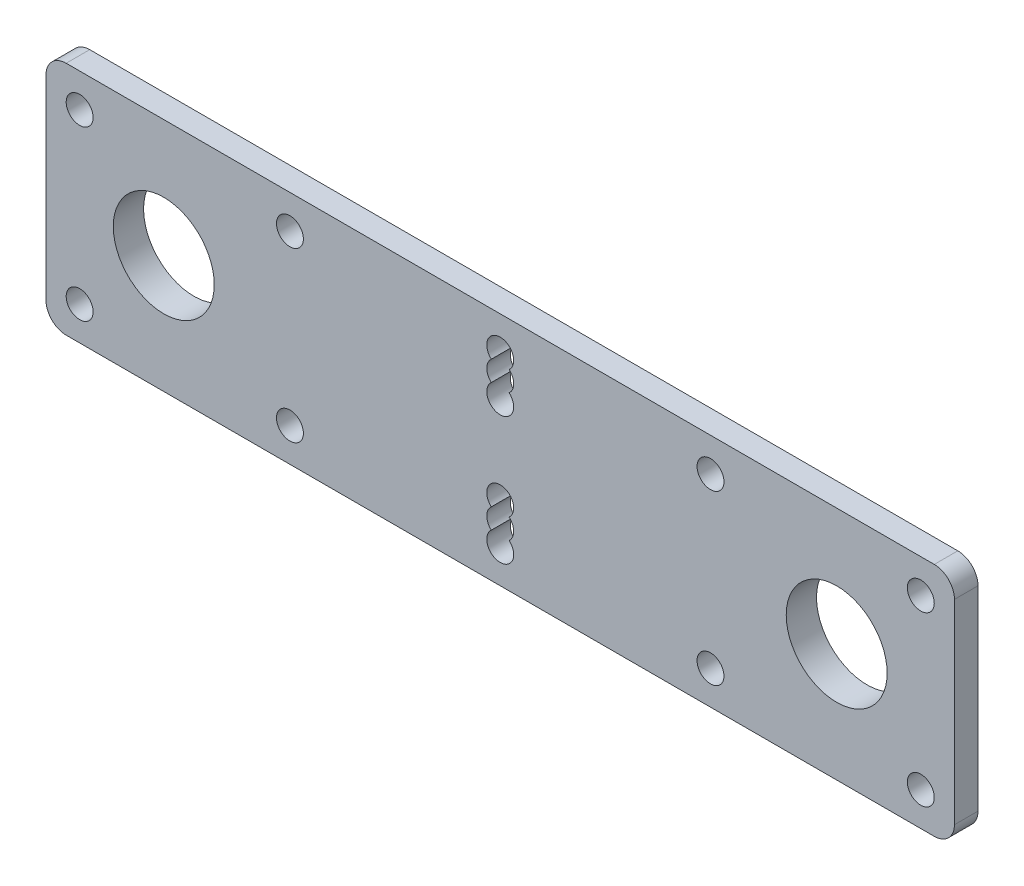
ISO-10303-21;
HEADER;
FILE_DESCRIPTION(('STEP AP214'),'2;1');
FILE_NAME('part.step','',(''),(''),'','','');
FILE_SCHEMA(('AUTOMOTIVE_DESIGN { 1 0 10303 214 1 1 1 1 }'));
ENDSEC;
DATA;
#1=APPLICATION_CONTEXT('core data for automotive mechanical design processes');
#2=APPLICATION_PROTOCOL_DEFINITION('international standard','automotive_design',2000,#1);
#3=PRODUCT_CONTEXT('',#1,'mechanical');
#4=PRODUCT('Part','Part','',(#3));
#5=PRODUCT_RELATED_PRODUCT_CATEGORY('part','',(#4));
#6=PRODUCT_DEFINITION_FORMATION('','',#4);
#7=PRODUCT_DEFINITION_CONTEXT('part definition',#1,'design');
#8=PRODUCT_DEFINITION('design','',#6,#7);
#9=PRODUCT_DEFINITION_SHAPE('','',#8);
#10=(LENGTH_UNIT() NAMED_UNIT(*) SI_UNIT(.MILLI.,.METRE.));
#11=(NAMED_UNIT(*) PLANE_ANGLE_UNIT() SI_UNIT($,.RADIAN.));
#12=(NAMED_UNIT(*) SI_UNIT($,.STERADIAN.) SOLID_ANGLE_UNIT());
#13=UNCERTAINTY_MEASURE_WITH_UNIT(LENGTH_MEASURE(1.E-05),#10,'distance_accuracy_value','');
#14=(GEOMETRIC_REPRESENTATION_CONTEXT(3) GLOBAL_UNCERTAINTY_ASSIGNED_CONTEXT((#13)) GLOBAL_UNIT_ASSIGNED_CONTEXT((#10,
#11,#12)) REPRESENTATION_CONTEXT('',''));
#15=CARTESIAN_POINT('',(0.,0.,0.));
#16=DIRECTION('',(0.,0.,1.));
#17=DIRECTION('',(1.,0.,0.));
#18=AXIS2_PLACEMENT_3D('',#15,#16,#17);
#19=CARTESIAN_POINT('',(0.,0.,0.));
#20=DIRECTION('',(0.,0.,1.));
#21=DIRECTION('',(1.,0.,0.));
#22=AXIS2_PLACEMENT_3D('',#19,#20,#21);
#23=PLANE('',#22);
#24=CARTESIAN_POINT('',(100.,0.,0.));
#25=DIRECTION('',(0.,0.,1.));
#26=DIRECTION('',(1.,0.,0.));
#27=AXIS2_PLACEMENT_3D('',#24,#25,#26);
#28=CIRCLE('',#27,20.);
#29=CARTESIAN_POINT('',(120.,0.,0.));
#30=VERTEX_POINT('',#29);
#31=EDGE_CURVE('E43',#30,#30,#28,.F.);
#32=ORIENTED_EDGE('',*,*,#31,.F.);
#33=EDGE_LOOP('',(#32));
#34=FACE_BOUND('',#33,.T.);
#35=CARTESIAN_POINT('',(-62.5,-25.,0.));
#36=DIRECTION('',(0.,0.,-1.));
#37=DIRECTION('',(1.,0.,0.));
#38=AXIS2_PLACEMENT_3D('',#35,#36,#37);
#39=CIRCLE('',#38,4.00000000000002);
#40=CARTESIAN_POINT('',(-58.5,-25.,0.));
#41=VERTEX_POINT('',#40);
#42=EDGE_CURVE('E179',#41,#41,#39,.T.);
#43=ORIENTED_EDGE('',*,*,#42,.F.);
#44=EDGE_LOOP('',(#43));
#45=FACE_BOUND('',#44,.T.);
#46=CARTESIAN_POINT('',(-125.,-25.,0.));
#47=DIRECTION('',(0.,0.,-1.));
#48=DIRECTION('',(1.,0.,0.));
#49=AXIS2_PLACEMENT_3D('',#46,#47,#48);
#50=CIRCLE('',#49,3.99999999999995);
#51=CARTESIAN_POINT('',(-121.,-25.,0.));
#52=VERTEX_POINT('',#51);
#53=EDGE_CURVE('E176',#52,#52,#50,.T.);
#54=ORIENTED_EDGE('',*,*,#53,.F.);
#55=EDGE_LOOP('',(#54));
#56=FACE_BOUND('',#55,.T.);
#57=CARTESIAN_POINT('',(-1.71545539115372E-13,13.,0.));
#58=DIRECTION('',(0.,0.,-1.));
#59=DIRECTION('',(-1.,0.,0.));
#60=AXIS2_PLACEMENT_3D('',#57,#58,#59);
#61=CIRCLE('',#60,4.);
#62=CARTESIAN_POINT('',(2.64575131106446,16.,0.));
#63=VERTEX_POINT('',#62);
#64=CARTESIAN_POINT('',(-2.64575131106472,16.,0.));
#65=VERTEX_POINT('',#64);
#66=EDGE_CURVE('E160',#63,#65,#61,.T.);
#67=ORIENTED_EDGE('',*,*,#66,.F.);
#68=CARTESIAN_POINT('',(0.,19.,0.));
#69=DIRECTION('',(0.,0.,-1.));
#70=DIRECTION('',(-1.,0.,0.));
#71=AXIS2_PLACEMENT_3D('',#68,#69,#70);
#72=CIRCLE('',#71,4.);
#73=CARTESIAN_POINT('',(2.64575131106454,22.,0.));
#74=VERTEX_POINT('',#73);
#75=EDGE_CURVE('E165',#74,#63,#72,.T.);
#76=ORIENTED_EDGE('',*,*,#75,.F.);
#77=CARTESIAN_POINT('',(0.,25.,0.));
#78=DIRECTION('',(0.,0.,-1.));
#79=DIRECTION('',(-1.,0.,0.));
#80=AXIS2_PLACEMENT_3D('',#77,#78,#79);
#81=CIRCLE('',#80,4.);
#82=CARTESIAN_POINT('',(-2.64575131106464,22.,0.));
#83=VERTEX_POINT('',#82);
#84=EDGE_CURVE('E169',#83,#74,#81,.T.);
#85=ORIENTED_EDGE('',*,*,#84,.F.);
#86=CARTESIAN_POINT('',(0.,19.,0.));
#87=DIRECTION('',(0.,0.,-1.));
#88=DIRECTION('',(-1.,0.,0.));
#89=AXIS2_PLACEMENT_3D('',#86,#87,#88);
#90=CIRCLE('',#89,4.);
#91=EDGE_CURVE('E150',#65,#83,#90,.T.);
#92=ORIENTED_EDGE('',*,*,#91,.F.);
#93=EDGE_LOOP('',(#67,#76,#85,#92));
#94=FACE_BOUND('',#93,.T.);
#95=CARTESIAN_POINT('',(62.5,25.,0.));
#96=DIRECTION('',(0.,0.,-1.));
#97=DIRECTION('',(-1.,0.,0.));
#98=AXIS2_PLACEMENT_3D('',#95,#96,#97);
#99=CIRCLE('',#98,4.00000000000001);
#100=CARTESIAN_POINT('',(58.5,25.,0.));
#101=VERTEX_POINT('',#100);
#102=EDGE_CURVE('E197',#101,#101,#99,.T.);
#103=ORIENTED_EDGE('',*,*,#102,.F.);
#104=EDGE_LOOP('',(#103));
#105=FACE_BOUND('',#104,.T.);
#106=CARTESIAN_POINT('',(125.,25.,0.));
#107=DIRECTION('',(0.,0.,-1.));
#108=DIRECTION('',(-1.,0.,0.));
#109=AXIS2_PLACEMENT_3D('',#106,#107,#108);
#110=CIRCLE('',#109,4.00000000000001);
#111=CARTESIAN_POINT('',(121.,25.,0.));
#112=VERTEX_POINT('',#111);
#113=EDGE_CURVE('E344',#112,#112,#110,.T.);
#114=ORIENTED_EDGE('',*,*,#113,.F.);
#115=EDGE_LOOP('',(#114));
#116=FACE_BOUND('',#115,.T.);
#117=CARTESIAN_POINT('',(62.5,-25.,0.));
#118=DIRECTION('',(0.,0.,-1.));
#119=DIRECTION('',(1.,0.,0.));
#120=AXIS2_PLACEMENT_3D('',#117,#118,#119);
#121=CIRCLE('',#120,4.00000000000001);
#122=CARTESIAN_POINT('',(66.5,-25.,0.));
#123=VERTEX_POINT('',#122);
#124=EDGE_CURVE('E182',#123,#123,#121,.T.);
#125=ORIENTED_EDGE('',*,*,#124,.F.);
#126=EDGE_LOOP('',(#125));
#127=FACE_BOUND('',#126,.T.);
#128=CARTESIAN_POINT('',(0.,-25.,0.));
#129=DIRECTION('',(0.,0.,-1.));
#130=DIRECTION('',(1.,0.,0.));
#131=AXIS2_PLACEMENT_3D('',#128,#129,#130);
#132=CIRCLE('',#131,4.);
#133=CARTESIAN_POINT('',(2.64575131106454,-22.,0.));
#134=VERTEX_POINT('',#133);
#135=CARTESIAN_POINT('',(-2.64575131106465,-22.,0.));
#136=VERTEX_POINT('',#135);
#137=EDGE_CURVE('E196',#134,#136,#132,.T.);
#138=ORIENTED_EDGE('',*,*,#137,.F.);
#139=CARTESIAN_POINT('',(0.,-19.,0.));
#140=DIRECTION('',(0.,0.,-1.));
#141=DIRECTION('',(1.,0.,0.));
#142=AXIS2_PLACEMENT_3D('',#139,#140,#141);
#143=CIRCLE('',#142,4.);
#144=CARTESIAN_POINT('',(2.64575131106446,-16.,0.));
#145=VERTEX_POINT('',#144);
#146=EDGE_CURVE('E194',#145,#134,#143,.T.);
#147=ORIENTED_EDGE('',*,*,#146,.F.);
#148=CARTESIAN_POINT('',(-1.71545539115372E-13,-13.,0.));
#149=DIRECTION('',(0.,0.,-1.));
#150=DIRECTION('',(1.,0.,0.));
#151=AXIS2_PLACEMENT_3D('',#148,#149,#150);
#152=CIRCLE('',#151,4.);
#153=CARTESIAN_POINT('',(-2.64575131106472,-16.,0.));
#154=VERTEX_POINT('',#153);
#155=EDGE_CURVE('E202',#154,#145,#152,.T.);
#156=ORIENTED_EDGE('',*,*,#155,.F.);
#157=CARTESIAN_POINT('',(0.,-19.,0.));
#158=DIRECTION('',(0.,0.,-1.));
#159=DIRECTION('',(1.,0.,0.));
#160=AXIS2_PLACEMENT_3D('',#157,#158,#159);
#161=CIRCLE('',#160,4.);
#162=EDGE_CURVE('E199',#136,#154,#161,.T.);
#163=ORIENTED_EDGE('',*,*,#162,.F.);
#164=EDGE_LOOP('',(#138,#147,#156,#163));
#165=FACE_BOUND('',#164,.T.);
#166=CARTESIAN_POINT('',(-62.5,25.,0.));
#167=DIRECTION('',(0.,0.,-1.));
#168=DIRECTION('',(-1.,0.,0.));
#169=AXIS2_PLACEMENT_3D('',#166,#167,#168);
#170=CIRCLE('',#169,4.00000000000002);
#171=CARTESIAN_POINT('',(-66.5,25.,0.));
#172=VERTEX_POINT('',#171);
#173=EDGE_CURVE('E190',#172,#172,#170,.T.);
#174=ORIENTED_EDGE('',*,*,#173,.F.);
#175=EDGE_LOOP('',(#174));
#176=FACE_BOUND('',#175,.T.);
#177=CARTESIAN_POINT('',(125.,-25.,0.));
#178=DIRECTION('',(0.,0.,-1.));
#179=DIRECTION('',(1.,0.,0.));
#180=AXIS2_PLACEMENT_3D('',#177,#178,#179);
#181=CIRCLE('',#180,4.00000000000001);
#182=CARTESIAN_POINT('',(129.,-25.,0.));
#183=VERTEX_POINT('',#182);
#184=EDGE_CURVE('E187',#183,#183,#181,.T.);
#185=ORIENTED_EDGE('',*,*,#184,.F.);
#186=EDGE_LOOP('',(#185));
#187=FACE_BOUND('',#186,.T.);
#188=CARTESIAN_POINT('',(-125.,25.,0.));
#189=DIRECTION('',(0.,0.,-1.));
#190=DIRECTION('',(-1.,0.,0.));
#191=AXIS2_PLACEMENT_3D('',#188,#189,#190);
#192=CIRCLE('',#191,3.99999999999995);
#193=CARTESIAN_POINT('',(-129.,25.,0.));
#194=VERTEX_POINT('',#193);
#195=EDGE_CURVE('E183',#194,#194,#192,.T.);
#196=ORIENTED_EDGE('',*,*,#195,.F.);
#197=EDGE_LOOP('',(#196));
#198=FACE_BOUND('',#197,.T.);
#199=DIRECTION('',(0.,1.,0.));
#200=VECTOR('',#199,1.);
#201=CARTESIAN_POINT('',(135.,35.,0.));
#202=LINE('',#201,#200);
#203=CARTESIAN_POINT('',(135.,-29.,0.));
#204=VERTEX_POINT('',#203);
#205=CARTESIAN_POINT('',(135.,29.,0.));
#206=VERTEX_POINT('',#205);
#207=EDGE_CURVE('E256',#204,#206,#202,.T.);
#208=ORIENTED_EDGE('',*,*,#207,.F.);
#209=CARTESIAN_POINT('',(129.,-29.,0.));
#210=DIRECTION('',(0.,0.,1.));
#211=DIRECTION('',(1.,0.,0.));
#212=AXIS2_PLACEMENT_3D('',#209,#210,#211);
#213=CIRCLE('',#212,6.);
#214=CARTESIAN_POINT('',(129.,-35.,0.));
#215=VERTEX_POINT('',#214);
#216=EDGE_CURVE('E291',#204,#215,#213,.F.);
#217=ORIENTED_EDGE('',*,*,#216,.T.);
#218=DIRECTION('',(1.,0.,0.));
#219=VECTOR('',#218,1.);
#220=CARTESIAN_POINT('',(-135.,-35.,0.));
#221=LINE('',#220,#219);
#222=CARTESIAN_POINT('',(-129.,-35.,0.));
#223=VERTEX_POINT('',#222);
#224=EDGE_CURVE('E261',#223,#215,#221,.T.);
#225=ORIENTED_EDGE('',*,*,#224,.F.);
#226=CARTESIAN_POINT('',(-129.,-29.,0.));
#227=DIRECTION('',(0.,0.,1.));
#228=DIRECTION('',(1.,0.,0.));
#229=AXIS2_PLACEMENT_3D('',#226,#227,#228);
#230=CIRCLE('',#229,6.);
#231=CARTESIAN_POINT('',(-135.,-29.,0.));
#232=VERTEX_POINT('',#231);
#233=EDGE_CURVE('E287',#223,#232,#230,.F.);
#234=ORIENTED_EDGE('',*,*,#233,.T.);
#235=DIRECTION('',(0.,-1.,0.));
#236=VECTOR('',#235,1.);
#237=CARTESIAN_POINT('',(-135.,35.,0.));
#238=LINE('',#237,#236);
#239=CARTESIAN_POINT('',(-135.,29.,0.));
#240=VERTEX_POINT('',#239);
#241=EDGE_CURVE('E276',#240,#232,#238,.T.);
#242=ORIENTED_EDGE('',*,*,#241,.F.);
#243=CARTESIAN_POINT('',(-129.,29.,0.));
#244=DIRECTION('',(0.,0.,1.));
#245=DIRECTION('',(1.,0.,0.));
#246=AXIS2_PLACEMENT_3D('',#243,#244,#245);
#247=CIRCLE('',#246,6.);
#248=CARTESIAN_POINT('',(-129.,35.,0.));
#249=VERTEX_POINT('',#248);
#250=EDGE_CURVE('E285',#240,#249,#247,.F.);
#251=ORIENTED_EDGE('',*,*,#250,.T.);
#252=DIRECTION('',(-1.,0.,0.));
#253=VECTOR('',#252,1.);
#254=CARTESIAN_POINT('',(-135.,35.,0.));
#255=LINE('',#254,#253);
#256=CARTESIAN_POINT('',(129.,35.,0.));
#257=VERTEX_POINT('',#256);
#258=EDGE_CURVE('E273',#257,#249,#255,.T.);
#259=ORIENTED_EDGE('',*,*,#258,.F.);
#260=CARTESIAN_POINT('',(129.,29.,0.));
#261=DIRECTION('',(0.,0.,1.));
#262=DIRECTION('',(1.,0.,0.));
#263=AXIS2_PLACEMENT_3D('',#260,#261,#262);
#264=CIRCLE('',#263,6.);
#265=EDGE_CURVE('E289',#257,#206,#264,.F.);
#266=ORIENTED_EDGE('',*,*,#265,.T.);
#267=EDGE_LOOP('',(#208,#217,#225,#234,#242,#251,#259,#266));
#268=FACE_BOUND('',#267,.T.);
#269=CARTESIAN_POINT('',(-100.,0.,0.));
#270=DIRECTION('',(0.,0.,1.));
#271=DIRECTION('',(1.,0.,0.));
#272=AXIS2_PLACEMENT_3D('',#269,#270,#271);
#273=CIRCLE('',#272,20.);
#274=CARTESIAN_POINT('',(-80.,0.,0.));
#275=VERTEX_POINT('',#274);
#276=EDGE_CURVE('E11',#275,#275,#273,.F.);
#277=ORIENTED_EDGE('',*,*,#276,.F.);
#278=EDGE_LOOP('',(#277));
#279=FACE_BOUND('',#278,.T.);
#280=ADVANCED_FACE('F35',(#34,#45,#56,#94,#105,#116,#127,#165,#176,#187,#198,#268,#279),#23,.F.);
#281=CARTESIAN_POINT('',(135.,35.,7.));
#282=DIRECTION('',(-1.,0.,0.));
#283=DIRECTION('',(0.,0.,1.));
#284=AXIS2_PLACEMENT_3D('',#281,#282,#283);
#285=PLANE('',#284);
#286=DIRECTION('',(0.,1.,0.));
#287=VECTOR('',#286,1.);
#288=CARTESIAN_POINT('',(135.,35.,7.));
#289=LINE('',#288,#287);
#290=CARTESIAN_POINT('',(135.,-29.,7.));
#291=VERTEX_POINT('',#290);
#292=CARTESIAN_POINT('',(135.,29.,7.));
#293=VERTEX_POINT('',#292);
#294=EDGE_CURVE('E257',#291,#293,#289,.T.);
#295=ORIENTED_EDGE('',*,*,#294,.F.);
#296=DIRECTION('',(0.,0.,-1.));
#297=VECTOR('',#296,1.);
#298=CARTESIAN_POINT('',(135.,-29.,7.));
#299=LINE('',#298,#297);
#300=EDGE_CURVE('E282',#291,#204,#299,.T.);
#301=ORIENTED_EDGE('',*,*,#300,.T.);
#302=ORIENTED_EDGE('',*,*,#207,.T.);
#303=DIRECTION('',(0.,0.,-1.));
#304=VECTOR('',#303,1.);
#305=CARTESIAN_POINT('',(135.,29.,7.));
#306=LINE('',#305,#304);
#307=EDGE_CURVE('E270',#206,#293,#306,.F.);
#308=ORIENTED_EDGE('',*,*,#307,.T.);
#309=EDGE_LOOP('',(#295,#301,#302,#308));
#310=FACE_BOUND('',#309,.T.);
#311=ADVANCED_FACE('F322',(#310),#285,.F.);
#312=CARTESIAN_POINT('',(-135.,35.,7.));
#313=DIRECTION('',(0.,-1.,0.));
#314=DIRECTION('',(0.,0.,-1.));
#315=AXIS2_PLACEMENT_3D('',#312,#313,#314);
#316=PLANE('',#315);
#317=DIRECTION('',(-1.,0.,0.));
#318=VECTOR('',#317,1.);
#319=CARTESIAN_POINT('',(-135.,35.,7.));
#320=LINE('',#319,#318);
#321=CARTESIAN_POINT('',(129.,35.,7.));
#322=VERTEX_POINT('',#321);
#323=CARTESIAN_POINT('',(-129.,35.,7.));
#324=VERTEX_POINT('',#323);
#325=EDGE_CURVE('E260',#322,#324,#320,.T.);
#326=ORIENTED_EDGE('',*,*,#325,.F.);
#327=DIRECTION('',(0.,0.,-1.));
#328=VECTOR('',#327,1.);
#329=CARTESIAN_POINT('',(129.,35.,7.));
#330=LINE('',#329,#328);
#331=EDGE_CURVE('E308',#322,#257,#330,.T.);
#332=ORIENTED_EDGE('',*,*,#331,.T.);
#333=ORIENTED_EDGE('',*,*,#258,.T.);
#334=DIRECTION('',(0.,0.,-1.));
#335=VECTOR('',#334,1.);
#336=CARTESIAN_POINT('',(-129.,35.,7.));
#337=LINE('',#336,#335);
#338=EDGE_CURVE('E306',#249,#324,#337,.F.);
#339=ORIENTED_EDGE('',*,*,#338,.T.);
#340=EDGE_LOOP('',(#326,#332,#333,#339));
#341=FACE_BOUND('',#340,.T.);
#342=ADVANCED_FACE('F461',(#341),#316,.F.);
#343=CARTESIAN_POINT('',(-135.,35.,7.));
#344=DIRECTION('',(1.,0.,0.));
#345=DIRECTION('',(0.,0.,-1.));
#346=AXIS2_PLACEMENT_3D('',#343,#344,#345);
#347=PLANE('',#346);
#348=ORIENTED_EDGE('',*,*,#241,.T.);
#349=DIRECTION('',(0.,0.,-1.));
#350=VECTOR('',#349,1.);
#351=CARTESIAN_POINT('',(-135.,-29.,7.));
#352=LINE('',#351,#350);
#353=CARTESIAN_POINT('',(-135.,-29.,7.));
#354=VERTEX_POINT('',#353);
#355=EDGE_CURVE('E314',#232,#354,#352,.F.);
#356=ORIENTED_EDGE('',*,*,#355,.T.);
#357=DIRECTION('',(0.,-1.,0.));
#358=VECTOR('',#357,1.);
#359=CARTESIAN_POINT('',(-135.,35.,7.));
#360=LINE('',#359,#358);
#361=CARTESIAN_POINT('',(-135.,29.,7.));
#362=VERTEX_POINT('',#361);
#363=EDGE_CURVE('E264',#362,#354,#360,.T.);
#364=ORIENTED_EDGE('',*,*,#363,.F.);
#365=DIRECTION('',(0.,0.,-1.));
#366=VECTOR('',#365,1.);
#367=CARTESIAN_POINT('',(-135.,29.,7.));
#368=LINE('',#367,#366);
#369=EDGE_CURVE('E311',#362,#240,#368,.T.);
#370=ORIENTED_EDGE('',*,*,#369,.T.);
#371=EDGE_LOOP('',(#348,#356,#364,#370));
#372=FACE_BOUND('',#371,.T.);
#373=ADVANCED_FACE('F457',(#372),#347,.F.);
#374=CARTESIAN_POINT('',(-135.,-35.,7.));
#375=DIRECTION('',(0.,1.,0.));
#376=DIRECTION('',(0.,0.,1.));
#377=AXIS2_PLACEMENT_3D('',#374,#375,#376);
#378=PLANE('',#377);
#379=ORIENTED_EDGE('',*,*,#224,.T.);
#380=DIRECTION('',(0.,0.,-1.));
#381=VECTOR('',#380,1.);
#382=CARTESIAN_POINT('',(129.,-35.,7.));
#383=LINE('',#382,#381);
#384=CARTESIAN_POINT('',(129.,-35.,7.));
#385=VERTEX_POINT('',#384);
#386=EDGE_CURVE('E296',#215,#385,#383,.F.);
#387=ORIENTED_EDGE('',*,*,#386,.T.);
#388=DIRECTION('',(1.,0.,0.));
#389=VECTOR('',#388,1.);
#390=CARTESIAN_POINT('',(-135.,-35.,7.));
#391=LINE('',#390,#389);
#392=CARTESIAN_POINT('',(-129.,-35.,7.));
#393=VERTEX_POINT('',#392);
#394=EDGE_CURVE('E267',#393,#385,#391,.T.);
#395=ORIENTED_EDGE('',*,*,#394,.F.);
#396=DIRECTION('',(0.,0.,-1.));
#397=VECTOR('',#396,1.);
#398=CARTESIAN_POINT('',(-129.,-35.,7.));
#399=LINE('',#398,#397);
#400=EDGE_CURVE('E293',#393,#223,#399,.T.);
#401=ORIENTED_EDGE('',*,*,#400,.T.);
#402=EDGE_LOOP('',(#379,#387,#395,#401));
#403=FACE_BOUND('',#402,.T.);
#404=ADVANCED_FACE('F452',(#403),#378,.F.);
#405=CARTESIAN_POINT('',(0.,0.,7.));
#406=DIRECTION('',(0.,0.,1.));
#407=DIRECTION('',(1.,0.,0.));
#408=AXIS2_PLACEMENT_3D('',#405,#406,#407);
#409=PLANE('',#408);
#410=CARTESIAN_POINT('',(-62.5,-25.,7.));
#411=DIRECTION('',(0.,0.,1.));
#412=DIRECTION('',(1.,0.,0.));
#413=AXIS2_PLACEMENT_3D('',#410,#411,#412);
#414=CIRCLE('',#413,4.00000000000002);
#415=CARTESIAN_POINT('',(-58.5,-25.,7.));
#416=VERTEX_POINT('',#415);
#417=EDGE_CURVE('E250',#416,#416,#414,.T.);
#418=ORIENTED_EDGE('',*,*,#417,.F.);
#419=EDGE_LOOP('',(#418));
#420=FACE_BOUND('',#419,.T.);
#421=CARTESIAN_POINT('',(-125.,-25.,7.));
#422=DIRECTION('',(0.,0.,1.));
#423=DIRECTION('',(1.,0.,0.));
#424=AXIS2_PLACEMENT_3D('',#421,#422,#423);
#425=CIRCLE('',#424,3.99999999999995);
#426=CARTESIAN_POINT('',(-121.,-25.,7.));
#427=VERTEX_POINT('',#426);
#428=EDGE_CURVE('E247',#427,#427,#425,.T.);
#429=ORIENTED_EDGE('',*,*,#428,.F.);
#430=EDGE_LOOP('',(#429));
#431=FACE_BOUND('',#430,.T.);
#432=CARTESIAN_POINT('',(0.,19.,7.));
#433=DIRECTION('',(0.,0.,1.));
#434=DIRECTION('',(1.,0.,0.));
#435=AXIS2_PLACEMENT_3D('',#432,#433,#434);
#436=CIRCLE('',#435,4.);
#437=CARTESIAN_POINT('',(2.64575131106446,16.,7.));
#438=VERTEX_POINT('',#437);
#439=CARTESIAN_POINT('',(2.64575131106454,22.,7.));
#440=VERTEX_POINT('',#439);
#441=EDGE_CURVE('E245',#438,#440,#436,.T.);
#442=ORIENTED_EDGE('',*,*,#441,.F.);
#443=CARTESIAN_POINT('',(-1.71545539115372E-13,13.,7.));
#444=DIRECTION('',(0.,0.,1.));
#445=DIRECTION('',(1.,0.,0.));
#446=AXIS2_PLACEMENT_3D('',#443,#444,#445);
#447=CIRCLE('',#446,4.);
#448=CARTESIAN_POINT('',(-2.64575131106472,16.,7.));
#449=VERTEX_POINT('',#448);
#450=EDGE_CURVE('E240',#449,#438,#447,.T.);
#451=ORIENTED_EDGE('',*,*,#450,.F.);
#452=CARTESIAN_POINT('',(0.,19.,7.));
#453=DIRECTION('',(0.,0.,1.));
#454=DIRECTION('',(1.,0.,0.));
#455=AXIS2_PLACEMENT_3D('',#452,#453,#454);
#456=CIRCLE('',#455,4.);
#457=CARTESIAN_POINT('',(-2.64575131106464,22.,7.));
#458=VERTEX_POINT('',#457);
#459=EDGE_CURVE('E153',#458,#449,#456,.T.);
#460=ORIENTED_EDGE('',*,*,#459,.F.);
#461=CARTESIAN_POINT('',(0.,25.,7.));
#462=DIRECTION('',(0.,0.,1.));
#463=DIRECTION('',(1.,0.,0.));
#464=AXIS2_PLACEMENT_3D('',#461,#462,#463);
#465=CIRCLE('',#464,4.);
#466=EDGE_CURVE('E243',#440,#458,#465,.T.);
#467=ORIENTED_EDGE('',*,*,#466,.F.);
#468=EDGE_LOOP('',(#442,#451,#460,#467));
#469=FACE_BOUND('',#468,.T.);
#470=CARTESIAN_POINT('',(62.5,25.,7.));
#471=DIRECTION('',(0.,0.,1.));
#472=DIRECTION('',(1.,0.,0.));
#473=AXIS2_PLACEMENT_3D('',#470,#471,#472);
#474=CIRCLE('',#473,4.00000000000001);
#475=CARTESIAN_POINT('',(66.5,25.,7.));
#476=VERTEX_POINT('',#475);
#477=EDGE_CURVE('E237',#476,#476,#474,.T.);
#478=ORIENTED_EDGE('',*,*,#477,.F.);
#479=EDGE_LOOP('',(#478));
#480=FACE_BOUND('',#479,.T.);
#481=CARTESIAN_POINT('',(125.,25.,7.));
#482=DIRECTION('',(0.,0.,1.));
#483=DIRECTION('',(1.,0.,0.));
#484=AXIS2_PLACEMENT_3D('',#481,#482,#483);
#485=CIRCLE('',#484,4.00000000000001);
#486=CARTESIAN_POINT('',(129.,25.,7.));
#487=VERTEX_POINT('',#486);
#488=EDGE_CURVE('E234',#487,#487,#485,.T.);
#489=ORIENTED_EDGE('',*,*,#488,.F.);
#490=EDGE_LOOP('',(#489));
#491=FACE_BOUND('',#490,.T.);
#492=CARTESIAN_POINT('',(62.5,-25.,7.));
#493=DIRECTION('',(0.,0.,1.));
#494=DIRECTION('',(1.,0.,0.));
#495=AXIS2_PLACEMENT_3D('',#492,#493,#494);
#496=CIRCLE('',#495,4.00000000000001);
#497=CARTESIAN_POINT('',(66.5,-25.,7.));
#498=VERTEX_POINT('',#497);
#499=EDGE_CURVE('E231',#498,#498,#496,.T.);
#500=ORIENTED_EDGE('',*,*,#499,.F.);
#501=EDGE_LOOP('',(#500));
#502=FACE_BOUND('',#501,.T.);
#503=CARTESIAN_POINT('',(0.,-19.,7.));
#504=DIRECTION('',(0.,0.,1.));
#505=DIRECTION('',(1.,0.,0.));
#506=AXIS2_PLACEMENT_3D('',#503,#504,#505);
#507=CIRCLE('',#506,4.);
#508=CARTESIAN_POINT('',(2.64575131106454,-22.,7.));
#509=VERTEX_POINT('',#508);
#510=CARTESIAN_POINT('',(2.64575131106446,-16.,7.));
#511=VERTEX_POINT('',#510);
#512=EDGE_CURVE('E229',#509,#511,#507,.T.);
#513=ORIENTED_EDGE('',*,*,#512,.F.);
#514=CARTESIAN_POINT('',(0.,-25.,7.));
#515=DIRECTION('',(0.,0.,1.));
#516=DIRECTION('',(1.,0.,0.));
#517=AXIS2_PLACEMENT_3D('',#514,#515,#516);
#518=CIRCLE('',#517,4.);
#519=CARTESIAN_POINT('',(-2.64575131106465,-22.,7.));
#520=VERTEX_POINT('',#519);
#521=EDGE_CURVE('E223',#520,#509,#518,.T.);
#522=ORIENTED_EDGE('',*,*,#521,.F.);
#523=CARTESIAN_POINT('',(0.,-19.,7.));
#524=DIRECTION('',(0.,0.,1.));
#525=DIRECTION('',(1.,0.,0.));
#526=AXIS2_PLACEMENT_3D('',#523,#524,#525);
#527=CIRCLE('',#526,4.);
#528=CARTESIAN_POINT('',(-2.64575131106472,-16.,7.));
#529=VERTEX_POINT('',#528);
#530=EDGE_CURVE('E225',#529,#520,#527,.T.);
#531=ORIENTED_EDGE('',*,*,#530,.F.);
#532=CARTESIAN_POINT('',(-1.71545539115372E-13,-13.,7.));
#533=DIRECTION('',(0.,0.,1.));
#534=DIRECTION('',(1.,0.,0.));
#535=AXIS2_PLACEMENT_3D('',#532,#533,#534);
#536=CIRCLE('',#535,4.);
#537=EDGE_CURVE('E227',#511,#529,#536,.T.);
#538=ORIENTED_EDGE('',*,*,#537,.F.);
#539=EDGE_LOOP('',(#513,#522,#531,#538));
#540=FACE_BOUND('',#539,.T.);
#541=CARTESIAN_POINT('',(-62.5,25.,7.));
#542=DIRECTION('',(0.,0.,1.));
#543=DIRECTION('',(1.,0.,0.));
#544=AXIS2_PLACEMENT_3D('',#541,#542,#543);
#545=CIRCLE('',#544,4.00000000000002);
#546=CARTESIAN_POINT('',(-58.5,25.,7.));
#547=VERTEX_POINT('',#546);
#548=EDGE_CURVE('E220',#547,#547,#545,.T.);
#549=ORIENTED_EDGE('',*,*,#548,.F.);
#550=EDGE_LOOP('',(#549));
#551=FACE_BOUND('',#550,.T.);
#552=CARTESIAN_POINT('',(125.,-25.,7.));
#553=DIRECTION('',(0.,0.,1.));
#554=DIRECTION('',(1.,0.,0.));
#555=AXIS2_PLACEMENT_3D('',#552,#553,#554);
#556=CIRCLE('',#555,4.00000000000001);
#557=CARTESIAN_POINT('',(129.,-25.,7.));
#558=VERTEX_POINT('',#557);
#559=EDGE_CURVE('E217',#558,#558,#556,.T.);
#560=ORIENTED_EDGE('',*,*,#559,.F.);
#561=EDGE_LOOP('',(#560));
#562=FACE_BOUND('',#561,.T.);
#563=CARTESIAN_POINT('',(-125.,25.,7.));
#564=DIRECTION('',(0.,0.,1.));
#565=DIRECTION('',(1.,0.,0.));
#566=AXIS2_PLACEMENT_3D('',#563,#564,#565);
#567=CIRCLE('',#566,3.99999999999995);
#568=CARTESIAN_POINT('',(-121.,25.,7.));
#569=VERTEX_POINT('',#568);
#570=EDGE_CURVE('E214',#569,#569,#567,.T.);
#571=ORIENTED_EDGE('',*,*,#570,.F.);
#572=EDGE_LOOP('',(#571));
#573=FACE_BOUND('',#572,.T.);
#574=CARTESIAN_POINT('',(-100.,0.,7.));
#575=DIRECTION('',(0.,0.,1.));
#576=DIRECTION('',(1.,0.,0.));
#577=AXIS2_PLACEMENT_3D('',#574,#575,#576);
#578=CIRCLE('',#577,15.);
#579=CARTESIAN_POINT('',(-85.,0.,7.));
#580=VERTEX_POINT('',#579);
#581=EDGE_CURVE('E186',#580,#580,#578,.T.);
#582=ORIENTED_EDGE('',*,*,#581,.F.);
#583=EDGE_LOOP('',(#582));
#584=FACE_BOUND('',#583,.T.);
#585=CARTESIAN_POINT('',(100.,0.,7.));
#586=DIRECTION('',(0.,0.,1.));
#587=DIRECTION('',(1.,0.,0.));
#588=AXIS2_PLACEMENT_3D('',#585,#586,#587);
#589=CIRCLE('',#588,15.);
#590=CARTESIAN_POINT('',(115.,0.,7.));
#591=VERTEX_POINT('',#590);
#592=EDGE_CURVE('E253',#591,#591,#589,.T.);
#593=ORIENTED_EDGE('',*,*,#592,.F.);
#594=EDGE_LOOP('',(#593));
#595=FACE_BOUND('',#594,.T.);
#596=ORIENTED_EDGE('',*,*,#394,.T.);
#597=CARTESIAN_POINT('',(129.,-29.,7.));
#598=DIRECTION('',(0.,0.,1.));
#599=DIRECTION('',(1.,0.,0.));
#600=AXIS2_PLACEMENT_3D('',#597,#598,#599);
#601=CIRCLE('',#600,6.);
#602=EDGE_CURVE('E304',#385,#291,#601,.T.);
#603=ORIENTED_EDGE('',*,*,#602,.T.);
#604=ORIENTED_EDGE('',*,*,#294,.T.);
#605=CARTESIAN_POINT('',(129.,29.,7.));
#606=DIRECTION('',(0.,0.,1.));
#607=DIRECTION('',(1.,0.,0.));
#608=AXIS2_PLACEMENT_3D('',#605,#606,#607);
#609=CIRCLE('',#608,6.);
#610=EDGE_CURVE('E302',#293,#322,#609,.T.);
#611=ORIENTED_EDGE('',*,*,#610,.T.);
#612=ORIENTED_EDGE('',*,*,#325,.T.);
#613=CARTESIAN_POINT('',(-129.,29.,7.));
#614=DIRECTION('',(0.,0.,1.));
#615=DIRECTION('',(1.,0.,0.));
#616=AXIS2_PLACEMENT_3D('',#613,#614,#615);
#617=CIRCLE('',#616,6.);
#618=EDGE_CURVE('E298',#324,#362,#617,.T.);
#619=ORIENTED_EDGE('',*,*,#618,.T.);
#620=ORIENTED_EDGE('',*,*,#363,.T.);
#621=CARTESIAN_POINT('',(-129.,-29.,7.));
#622=DIRECTION('',(0.,0.,1.));
#623=DIRECTION('',(1.,0.,0.));
#624=AXIS2_PLACEMENT_3D('',#621,#622,#623);
#625=CIRCLE('',#624,6.);
#626=EDGE_CURVE('E300',#354,#393,#625,.T.);
#627=ORIENTED_EDGE('',*,*,#626,.T.);
#628=EDGE_LOOP('',(#596,#603,#604,#611,#612,#619,#620,#627));
#629=FACE_BOUND('',#628,.T.);
#630=ADVANCED_FACE('F449',(#420,#431,#469,#480,#491,#502,#540,#551,#562,#573,#584,#595,#629),
#409,.T.);
#631=CARTESIAN_POINT('',(129.,-29.,7.));
#632=DIRECTION('',(0.,0.,-1.));
#633=DIRECTION('',(-1.,0.,0.));
#634=AXIS2_PLACEMENT_3D('',#631,#632,#633);
#635=CYLINDRICAL_SURFACE('',#634,6.);
#636=ORIENTED_EDGE('',*,*,#602,.F.);
#637=ORIENTED_EDGE('',*,*,#386,.F.);
#638=ORIENTED_EDGE('',*,*,#216,.F.);
#639=ORIENTED_EDGE('',*,*,#300,.F.);
#640=EDGE_LOOP('',(#636,#637,#638,#639));
#641=FACE_BOUND('',#640,.T.);
#642=ADVANCED_FACE('F451',(#641),#635,.T.);
#643=CARTESIAN_POINT('',(129.,29.,7.));
#644=DIRECTION('',(0.,0.,-1.));
#645=DIRECTION('',(-1.,0.,0.));
#646=AXIS2_PLACEMENT_3D('',#643,#644,#645);
#647=CYLINDRICAL_SURFACE('',#646,6.);
#648=ORIENTED_EDGE('',*,*,#610,.F.);
#649=ORIENTED_EDGE('',*,*,#307,.F.);
#650=ORIENTED_EDGE('',*,*,#265,.F.);
#651=ORIENTED_EDGE('',*,*,#331,.F.);
#652=EDGE_LOOP('',(#648,#649,#650,#651));
#653=FACE_BOUND('',#652,.T.);
#654=ADVANCED_FACE('F471',(#653),#647,.T.);
#655=CARTESIAN_POINT('',(-129.,-29.,7.));
#656=DIRECTION('',(0.,0.,-1.));
#657=DIRECTION('',(-1.,0.,0.));
#658=AXIS2_PLACEMENT_3D('',#655,#656,#657);
#659=CYLINDRICAL_SURFACE('',#658,6.);
#660=ORIENTED_EDGE('',*,*,#626,.F.);
#661=ORIENTED_EDGE('',*,*,#355,.F.);
#662=ORIENTED_EDGE('',*,*,#233,.F.);
#663=ORIENTED_EDGE('',*,*,#400,.F.);
#664=EDGE_LOOP('',(#660,#661,#662,#663));
#665=FACE_BOUND('',#664,.T.);
#666=ADVANCED_FACE('F474',(#665),#659,.T.);
#667=CARTESIAN_POINT('',(-129.,29.,7.));
#668=DIRECTION('',(0.,0.,-1.));
#669=DIRECTION('',(-1.,0.,0.));
#670=AXIS2_PLACEMENT_3D('',#667,#668,#669);
#671=CYLINDRICAL_SURFACE('',#670,6.);
#672=ORIENTED_EDGE('',*,*,#618,.F.);
#673=ORIENTED_EDGE('',*,*,#338,.F.);
#674=ORIENTED_EDGE('',*,*,#250,.F.);
#675=ORIENTED_EDGE('',*,*,#369,.F.);
#676=EDGE_LOOP('',(#672,#673,#674,#675));
#677=FACE_BOUND('',#676,.T.);
#678=ADVANCED_FACE('F37',(#677),#671,.T.);
#679=CARTESIAN_POINT('',(100.,0.,10.));
#680=DIRECTION('',(0.,0.,-1.));
#681=DIRECTION('',(-1.,0.,0.));
#682=AXIS2_PLACEMENT_3D('',#679,#680,#681);
#683=CYLINDRICAL_SURFACE('',#682,15.);
#684=ORIENTED_EDGE('',*,*,#592,.T.);
#685=EDGE_LOOP('',(#684));
#686=FACE_BOUND('',#685,.T.);
#687=CARTESIAN_POINT('',(100.,0.,-2.));
#688=DIRECTION('',(0.,0.,-1.));
#689=DIRECTION('',(-1.,0.,0.));
#690=AXIS2_PLACEMENT_3D('',#687,#688,#689);
#691=CIRCLE('',#690,15.);
#692=CARTESIAN_POINT('',(85.,0.,-2.));
#693=VERTEX_POINT('',#692);
#694=EDGE_CURVE('E335',#693,#693,#691,.T.);
#695=ORIENTED_EDGE('',*,*,#694,.T.);
#696=EDGE_LOOP('',(#695));
#697=FACE_BOUND('',#696,.T.);
#698=ADVANCED_FACE('F419',(#686,#697),#683,.F.);
#699=CARTESIAN_POINT('',(-100.,0.,10.));
#700=DIRECTION('',(0.,0.,-1.));
#701=DIRECTION('',(-1.,0.,0.));
#702=AXIS2_PLACEMENT_3D('',#699,#700,#701);
#703=CYLINDRICAL_SURFACE('',#702,15.);
#704=ORIENTED_EDGE('',*,*,#581,.T.);
#705=EDGE_LOOP('',(#704));
#706=FACE_BOUND('',#705,.T.);
#707=CARTESIAN_POINT('',(-100.,0.,-2.));
#708=DIRECTION('',(0.,0.,-1.));
#709=DIRECTION('',(-1.,0.,0.));
#710=AXIS2_PLACEMENT_3D('',#707,#708,#709);
#711=CIRCLE('',#710,15.);
#712=CARTESIAN_POINT('',(-115.,0.,-2.));
#713=VERTEX_POINT('',#712);
#714=EDGE_CURVE('E728',#713,#713,#711,.T.);
#715=ORIENTED_EDGE('',*,*,#714,.T.);
#716=EDGE_LOOP('',(#715));
#717=FACE_BOUND('',#716,.T.);
#718=ADVANCED_FACE('F415',(#706,#717),#703,.F.);
#719=CARTESIAN_POINT('',(-125.,25.,10.));
#720=DIRECTION('',(0.,0.,-1.));
#721=DIRECTION('',(-1.,0.,0.));
#722=AXIS2_PLACEMENT_3D('',#719,#720,#721);
#723=CYLINDRICAL_SURFACE('',#722,3.99999999999995);
#724=ORIENTED_EDGE('',*,*,#570,.T.);
#725=EDGE_LOOP('',(#724));
#726=FACE_BOUND('',#725,.T.);
#727=ORIENTED_EDGE('',*,*,#195,.T.);
#728=EDGE_LOOP('',(#727));
#729=FACE_BOUND('',#728,.T.);
#730=ADVANCED_FACE('F418',(#726,#729),#723,.F.);
#731=CARTESIAN_POINT('',(125.,-25.,10.));
#732=DIRECTION('',(0.,0.,-1.));
#733=DIRECTION('',(-1.,0.,0.));
#734=AXIS2_PLACEMENT_3D('',#731,#732,#733);
#735=CYLINDRICAL_SURFACE('',#734,4.00000000000001);
#736=ORIENTED_EDGE('',*,*,#559,.T.);
#737=EDGE_LOOP('',(#736));
#738=FACE_BOUND('',#737,.T.);
#739=ORIENTED_EDGE('',*,*,#184,.T.);
#740=EDGE_LOOP('',(#739));
#741=FACE_BOUND('',#740,.T.);
#742=ADVANCED_FACE('F423',(#738,#741),#735,.F.);
#743=CARTESIAN_POINT('',(-62.5,25.,10.));
#744=DIRECTION('',(0.,0.,-1.));
#745=DIRECTION('',(-1.,0.,0.));
#746=AXIS2_PLACEMENT_3D('',#743,#744,#745);
#747=CYLINDRICAL_SURFACE('',#746,4.00000000000002);
#748=ORIENTED_EDGE('',*,*,#548,.T.);
#749=EDGE_LOOP('',(#748));
#750=FACE_BOUND('',#749,.T.);
#751=ORIENTED_EDGE('',*,*,#173,.T.);
#752=EDGE_LOOP('',(#751));
#753=FACE_BOUND('',#752,.T.);
#754=ADVANCED_FACE('F427',(#750,#753),#747,.F.);
#755=CARTESIAN_POINT('',(0.,-19.,10.));
#756=DIRECTION('',(0.,0.,-1.));
#757=DIRECTION('',(-1.,0.,0.));
#758=AXIS2_PLACEMENT_3D('',#755,#756,#757);
#759=CYLINDRICAL_SURFACE('',#758,4.);
#760=ORIENTED_EDGE('',*,*,#512,.T.);
#761=DIRECTION('',(0.,0.,-1.));
#762=VECTOR('',#761,1.);
#763=CARTESIAN_POINT('',(2.64575131106446,-16.,10.));
#764=LINE('',#763,#762);
#765=EDGE_CURVE('E193',#511,#145,#764,.T.);
#766=ORIENTED_EDGE('',*,*,#765,.T.);
#767=ORIENTED_EDGE('',*,*,#146,.T.);
#768=DIRECTION('',(0.,0.,-1.));
#769=VECTOR('',#768,1.);
#770=CARTESIAN_POINT('',(2.64575131106454,-22.,10.));
#771=LINE('',#770,#769);
#772=EDGE_CURVE('E205',#509,#134,#771,.T.);
#773=ORIENTED_EDGE('',*,*,#772,.F.);
#774=EDGE_LOOP('',(#760,#766,#767,#773));
#775=FACE_BOUND('',#774,.T.);
#776=ADVANCED_FACE('F431',(#775),#759,.F.);
#777=CARTESIAN_POINT('',(-1.71545539115372E-13,-13.,10.));
#778=DIRECTION('',(0.,0.,-1.));
#779=DIRECTION('',(-1.,0.,0.));
#780=AXIS2_PLACEMENT_3D('',#777,#778,#779);
#781=CYLINDRICAL_SURFACE('',#780,4.);
#782=ORIENTED_EDGE('',*,*,#537,.T.);
#783=DIRECTION('',(0.,0.,-1.));
#784=VECTOR('',#783,1.);
#785=CARTESIAN_POINT('',(-2.64575131106472,-16.,10.));
#786=LINE('',#785,#784);
#787=EDGE_CURVE('E207',#529,#154,#786,.T.);
#788=ORIENTED_EDGE('',*,*,#787,.T.);
#789=ORIENTED_EDGE('',*,*,#155,.T.);
#790=ORIENTED_EDGE('',*,*,#765,.F.);
#791=EDGE_LOOP('',(#782,#788,#789,#790));
#792=FACE_BOUND('',#791,.T.);
#793=ADVANCED_FACE('F433',(#792),#781,.F.);
#794=CARTESIAN_POINT('',(0.,-19.,10.));
#795=DIRECTION('',(0.,0.,-1.));
#796=DIRECTION('',(-1.,0.,0.));
#797=AXIS2_PLACEMENT_3D('',#794,#795,#796);
#798=CYLINDRICAL_SURFACE('',#797,4.);
#799=ORIENTED_EDGE('',*,*,#530,.T.);
#800=DIRECTION('',(0.,0.,-1.));
#801=VECTOR('',#800,1.);
#802=CARTESIAN_POINT('',(-2.64575131106465,-22.,10.));
#803=LINE('',#802,#801);
#804=EDGE_CURVE('E58',#520,#136,#803,.T.);
#805=ORIENTED_EDGE('',*,*,#804,.T.);
#806=ORIENTED_EDGE('',*,*,#162,.T.);
#807=ORIENTED_EDGE('',*,*,#787,.F.);
#808=EDGE_LOOP('',(#799,#805,#806,#807));
#809=FACE_BOUND('',#808,.T.);
#810=ADVANCED_FACE('F436',(#809),#798,.F.);
#811=CARTESIAN_POINT('',(0.,-25.,10.));
#812=DIRECTION('',(0.,0.,-1.));
#813=DIRECTION('',(-1.,0.,0.));
#814=AXIS2_PLACEMENT_3D('',#811,#812,#813);
#815=CYLINDRICAL_SURFACE('',#814,4.);
#816=ORIENTED_EDGE('',*,*,#521,.T.);
#817=ORIENTED_EDGE('',*,*,#772,.T.);
#818=ORIENTED_EDGE('',*,*,#137,.T.);
#819=ORIENTED_EDGE('',*,*,#804,.F.);
#820=EDGE_LOOP('',(#816,#817,#818,#819));
#821=FACE_BOUND('',#820,.T.);
#822=ADVANCED_FACE('F392',(#821),#815,.F.);
#823=CARTESIAN_POINT('',(62.5,-25.,10.));
#824=DIRECTION('',(0.,0.,-1.));
#825=DIRECTION('',(-1.,0.,0.));
#826=AXIS2_PLACEMENT_3D('',#823,#824,#825);
#827=CYLINDRICAL_SURFACE('',#826,4.00000000000001);
#828=ORIENTED_EDGE('',*,*,#499,.T.);
#829=EDGE_LOOP('',(#828));
#830=FACE_BOUND('',#829,.T.);
#831=ORIENTED_EDGE('',*,*,#124,.T.);
#832=EDGE_LOOP('',(#831));
#833=FACE_BOUND('',#832,.T.);
#834=ADVANCED_FACE('F349',(#830,#833),#827,.F.);
#835=CARTESIAN_POINT('',(125.,25.,10.));
#836=DIRECTION('',(0.,0.,-1.));
#837=DIRECTION('',(-1.,0.,0.));
#838=AXIS2_PLACEMENT_3D('',#835,#836,#837);
#839=CYLINDRICAL_SURFACE('',#838,4.00000000000001);
#840=ORIENTED_EDGE('',*,*,#488,.T.);
#841=EDGE_LOOP('',(#840));
#842=FACE_BOUND('',#841,.T.);
#843=ORIENTED_EDGE('',*,*,#113,.T.);
#844=EDGE_LOOP('',(#843));
#845=FACE_BOUND('',#844,.T.);
#846=ADVANCED_FACE('F385',(#842,#845),#839,.F.);
#847=CARTESIAN_POINT('',(62.5,25.,10.));
#848=DIRECTION('',(0.,0.,-1.));
#849=DIRECTION('',(-1.,0.,0.));
#850=AXIS2_PLACEMENT_3D('',#847,#848,#849);
#851=CYLINDRICAL_SURFACE('',#850,4.00000000000001);
#852=ORIENTED_EDGE('',*,*,#477,.T.);
#853=EDGE_LOOP('',(#852));
#854=FACE_BOUND('',#853,.T.);
#855=ORIENTED_EDGE('',*,*,#102,.T.);
#856=EDGE_LOOP('',(#855));
#857=FACE_BOUND('',#856,.T.);
#858=ADVANCED_FACE('F388',(#854,#857),#851,.F.);
#859=CARTESIAN_POINT('',(0.,19.,10.));
#860=DIRECTION('',(0.,0.,-1.));
#861=DIRECTION('',(-1.,0.,0.));
#862=AXIS2_PLACEMENT_3D('',#859,#860,#861);
#863=CYLINDRICAL_SURFACE('',#862,4.);
#864=ORIENTED_EDGE('',*,*,#441,.T.);
#865=DIRECTION('',(0.,0.,-1.));
#866=VECTOR('',#865,1.);
#867=CARTESIAN_POINT('',(2.64575131106454,22.,10.));
#868=LINE('',#867,#866);
#869=EDGE_CURVE('E174',#440,#74,#868,.T.);
#870=ORIENTED_EDGE('',*,*,#869,.T.);
#871=ORIENTED_EDGE('',*,*,#75,.T.);
#872=DIRECTION('',(0.,0.,-1.));
#873=VECTOR('',#872,1.);
#874=CARTESIAN_POINT('',(2.64575131106446,16.,10.));
#875=LINE('',#874,#873);
#876=EDGE_CURVE('E156',#438,#63,#875,.T.);
#877=ORIENTED_EDGE('',*,*,#876,.F.);
#878=EDGE_LOOP('',(#864,#870,#871,#877));
#879=FACE_BOUND('',#878,.T.);
#880=ADVANCED_FACE('F396',(#879),#863,.F.);
#881=CARTESIAN_POINT('',(0.,25.,10.));
#882=DIRECTION('',(0.,0.,-1.));
#883=DIRECTION('',(-1.,0.,0.));
#884=AXIS2_PLACEMENT_3D('',#881,#882,#883);
#885=CYLINDRICAL_SURFACE('',#884,4.);
#886=ORIENTED_EDGE('',*,*,#466,.T.);
#887=DIRECTION('',(0.,0.,-1.));
#888=VECTOR('',#887,1.);
#889=CARTESIAN_POINT('',(-2.64575131106464,22.,10.));
#890=LINE('',#889,#888);
#891=EDGE_CURVE('E155',#458,#83,#890,.T.);
#892=ORIENTED_EDGE('',*,*,#891,.T.);
#893=ORIENTED_EDGE('',*,*,#84,.T.);
#894=ORIENTED_EDGE('',*,*,#869,.F.);
#895=EDGE_LOOP('',(#886,#892,#893,#894));
#896=FACE_BOUND('',#895,.T.);
#897=ADVANCED_FACE('F402',(#896),#885,.F.);
#898=CARTESIAN_POINT('',(0.,19.,10.));
#899=DIRECTION('',(0.,0.,-1.));
#900=DIRECTION('',(-1.,0.,0.));
#901=AXIS2_PLACEMENT_3D('',#898,#899,#900);
#902=CYLINDRICAL_SURFACE('',#901,4.);
#903=ORIENTED_EDGE('',*,*,#459,.T.);
#904=DIRECTION('',(0.,0.,-1.));
#905=VECTOR('',#904,1.);
#906=CARTESIAN_POINT('',(-2.64575131106472,16.,10.));
#907=LINE('',#906,#905);
#908=EDGE_CURVE('E50',#449,#65,#907,.T.);
#909=ORIENTED_EDGE('',*,*,#908,.T.);
#910=ORIENTED_EDGE('',*,*,#91,.T.);
#911=ORIENTED_EDGE('',*,*,#891,.F.);
#912=EDGE_LOOP('',(#903,#909,#910,#911));
#913=FACE_BOUND('',#912,.T.);
#914=ADVANCED_FACE('F147',(#913),#902,.F.);
#915=CARTESIAN_POINT('',(-1.71545539115372E-13,13.,10.));
#916=DIRECTION('',(0.,0.,-1.));
#917=DIRECTION('',(-1.,0.,0.));
#918=AXIS2_PLACEMENT_3D('',#915,#916,#917);
#919=CYLINDRICAL_SURFACE('',#918,4.);
#920=ORIENTED_EDGE('',*,*,#450,.T.);
#921=ORIENTED_EDGE('',*,*,#876,.T.);
#922=ORIENTED_EDGE('',*,*,#66,.T.);
#923=ORIENTED_EDGE('',*,*,#908,.F.);
#924=EDGE_LOOP('',(#920,#921,#922,#923));
#925=FACE_BOUND('',#924,.T.);
#926=ADVANCED_FACE('F161',(#925),#919,.F.);
#927=CARTESIAN_POINT('',(-125.,-25.,10.));
#928=DIRECTION('',(0.,0.,-1.));
#929=DIRECTION('',(-1.,0.,0.));
#930=AXIS2_PLACEMENT_3D('',#927,#928,#929);
#931=CYLINDRICAL_SURFACE('',#930,3.99999999999995);
#932=ORIENTED_EDGE('',*,*,#428,.T.);
#933=EDGE_LOOP('',(#932));
#934=FACE_BOUND('',#933,.T.);
#935=ORIENTED_EDGE('',*,*,#53,.T.);
#936=EDGE_LOOP('',(#935));
#937=FACE_BOUND('',#936,.T.);
#938=ADVANCED_FACE('F398',(#934,#937),#931,.F.);
#939=CARTESIAN_POINT('',(-62.5,-25.,10.));
#940=DIRECTION('',(0.,0.,-1.));
#941=DIRECTION('',(-1.,0.,0.));
#942=AXIS2_PLACEMENT_3D('',#939,#940,#941);
#943=CYLINDRICAL_SURFACE('',#942,4.00000000000002);
#944=ORIENTED_EDGE('',*,*,#417,.T.);
#945=EDGE_LOOP('',(#944));
#946=FACE_BOUND('',#945,.T.);
#947=ORIENTED_EDGE('',*,*,#42,.T.);
#948=EDGE_LOOP('',(#947));
#949=FACE_BOUND('',#948,.T.);
#950=ADVANCED_FACE('F381',(#946,#949),#943,.F.);
#951=CARTESIAN_POINT('',(100.,0.,-2.));
#952=DIRECTION('',(0.,0.,-1.));
#953=DIRECTION('',(-1.,0.,0.));
#954=AXIS2_PLACEMENT_3D('',#951,#952,#953);
#955=PLANE('',#954);
#956=CARTESIAN_POINT('',(100.,0.,-2.));
#957=DIRECTION('',(0.,0.,-1.));
#958=DIRECTION('',(-1.,0.,0.));
#959=AXIS2_PLACEMENT_3D('',#956,#957,#958);
#960=CIRCLE('',#959,20.);
#961=CARTESIAN_POINT('',(80.,0.,-2.));
#962=VERTEX_POINT('',#961);
#963=EDGE_CURVE('E332',#962,#962,#960,.T.);
#964=ORIENTED_EDGE('',*,*,#963,.T.);
#965=EDGE_LOOP('',(#964));
#966=FACE_BOUND('',#965,.T.);
#967=ORIENTED_EDGE('',*,*,#694,.F.);
#968=EDGE_LOOP('',(#967));
#969=FACE_BOUND('',#968,.T.);
#970=ADVANCED_FACE('F378',(#966,#969),#955,.T.);
#971=CARTESIAN_POINT('',(100.,0.,-2.));
#972=DIRECTION('',(0.,0.,1.));
#973=DIRECTION('',(1.,0.,0.));
#974=AXIS2_PLACEMENT_3D('',#971,#972,#973);
#975=CYLINDRICAL_SURFACE('',#974,20.);
#976=ORIENTED_EDGE('',*,*,#963,.F.);
#977=EDGE_LOOP('',(#976));
#978=FACE_BOUND('',#977,.T.);
#979=ORIENTED_EDGE('',*,*,#31,.T.);
#980=EDGE_LOOP('',(#979));
#981=FACE_BOUND('',#980,.T.);
#982=ADVANCED_FACE('F318',(#978,#981),#975,.T.);
#983=CARTESIAN_POINT('',(-100.,0.,-2.));
#984=DIRECTION('',(0.,0.,-1.));
#985=DIRECTION('',(-1.,0.,0.));
#986=AXIS2_PLACEMENT_3D('',#983,#984,#985);
#987=PLANE('',#986);
#988=CARTESIAN_POINT('',(-100.,0.,-2.));
#989=DIRECTION('',(0.,0.,-1.));
#990=DIRECTION('',(-1.,0.,0.));
#991=AXIS2_PLACEMENT_3D('',#988,#989,#990);
#992=CIRCLE('',#991,20.);
#993=CARTESIAN_POINT('',(-120.,0.,-2.));
#994=VERTEX_POINT('',#993);
#995=EDGE_CURVE('E340',#994,#994,#992,.T.);
#996=ORIENTED_EDGE('',*,*,#995,.T.);
#997=EDGE_LOOP('',(#996));
#998=FACE_BOUND('',#997,.T.);
#999=ORIENTED_EDGE('',*,*,#714,.F.);
#1000=EDGE_LOOP('',(#999));
#1001=FACE_BOUND('',#1000,.T.);
#1002=ADVANCED_FACE('F368',(#998,#1001),#987,.T.);
#1003=CARTESIAN_POINT('',(-100.,0.,-2.));
#1004=DIRECTION('',(0.,0.,1.));
#1005=DIRECTION('',(1.,0.,0.));
#1006=AXIS2_PLACEMENT_3D('',#1003,#1004,#1005);
#1007=CYLINDRICAL_SURFACE('',#1006,20.);
#1008=ORIENTED_EDGE('',*,*,#995,.F.);
#1009=EDGE_LOOP('',(#1008));
#1010=FACE_BOUND('',#1009,.T.);
#1011=ORIENTED_EDGE('',*,*,#276,.T.);
#1012=EDGE_LOOP('',(#1011));
#1013=FACE_BOUND('',#1012,.T.);
#1014=ADVANCED_FACE('F366',(#1010,#1013),#1007,.T.);
#1015=CLOSED_SHELL('',(#280,#311,#342,#373,#404,#630,#642,#654,#666,#678,#698,#718,#730,#742,
#754,#776,#793,#810,#822,#834,#846,#858,#880,#897,#914,#926,#938,#950,#970,#982,#1002,#1014));
#1016=MANIFOLD_SOLID_BREP('B2',#1015);
#1017=ADVANCED_BREP_SHAPE_REPRESENTATION('',(#18,#1016),#14);
#1018=SHAPE_DEFINITION_REPRESENTATION(#9,#1017);
ENDSEC;
END-ISO-10303-21;
